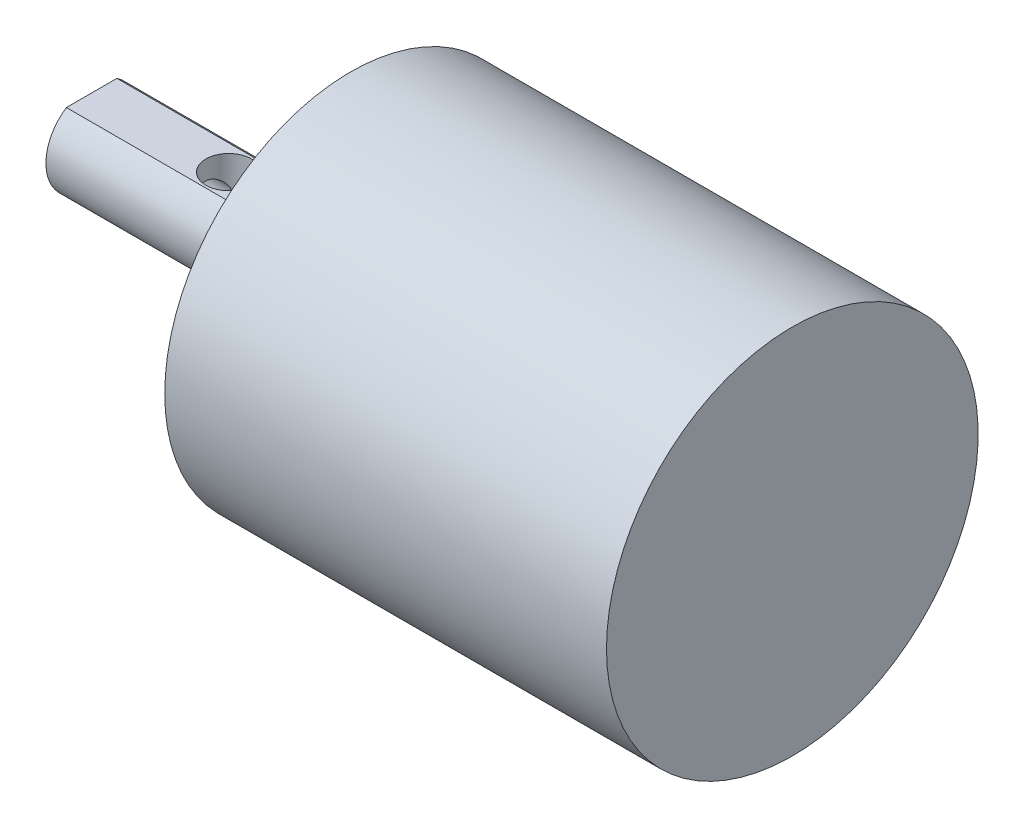
ISO-10303-21;
HEADER;
FILE_DESCRIPTION(('STEP AP214'),'2;1');
FILE_NAME('part.step','',(''),(''),'','','');
FILE_SCHEMA(('AUTOMOTIVE_DESIGN { 1 0 10303 214 1 1 1 1 }'));
ENDSEC;
DATA;
#1=APPLICATION_CONTEXT('core data for automotive mechanical design processes');
#2=APPLICATION_PROTOCOL_DEFINITION('international standard','automotive_design',2000,#1);
#3=PRODUCT_CONTEXT('',#1,'mechanical');
#4=PRODUCT('Part','Part','',(#3));
#5=PRODUCT_RELATED_PRODUCT_CATEGORY('part','',(#4));
#6=PRODUCT_DEFINITION_FORMATION('','',#4);
#7=PRODUCT_DEFINITION_CONTEXT('part definition',#1,'design');
#8=PRODUCT_DEFINITION('design','',#6,#7);
#9=PRODUCT_DEFINITION_SHAPE('','',#8);
#10=(LENGTH_UNIT() NAMED_UNIT(*) SI_UNIT(.MILLI.,.METRE.));
#11=(NAMED_UNIT(*) PLANE_ANGLE_UNIT() SI_UNIT($,.RADIAN.));
#12=(NAMED_UNIT(*) SI_UNIT($,.STERADIAN.) SOLID_ANGLE_UNIT());
#13=UNCERTAINTY_MEASURE_WITH_UNIT(LENGTH_MEASURE(1.E-05),#10,'distance_accuracy_value','');
#14=(GEOMETRIC_REPRESENTATION_CONTEXT(3) GLOBAL_UNCERTAINTY_ASSIGNED_CONTEXT((#13)) GLOBAL_UNIT_ASSIGNED_CONTEXT((#10,
#11,#12)) REPRESENTATION_CONTEXT('',''));
#15=CARTESIAN_POINT('',(0.,0.,0.));
#16=DIRECTION('',(0.,0.,1.));
#17=DIRECTION('',(1.,0.,0.));
#18=AXIS2_PLACEMENT_3D('',#15,#16,#17);
#19=CARTESIAN_POINT('',(-31.6,0.,-5.7));
#20=DIRECTION('',(-1.,0.,0.));
#21=DIRECTION('',(0.,0.,1.));
#22=AXIS2_PLACEMENT_3D('',#19,#20,#21);
#23=PLANE('',#22);
#24=CARTESIAN_POINT('',(-31.6,0.,-12.2));
#25=DIRECTION('',(-1.,0.,0.));
#26=DIRECTION('',(0.,0.,1.));
#27=AXIS2_PLACEMENT_3D('',#24,#25,#26);
#28=CIRCLE('',#27,6.5);
#29=CARTESIAN_POINT('',(-31.6,0.,-5.7));
#30=VERTEX_POINT('',#29);
#31=EDGE_CURVE('E246',#30,#30,#28,.T.);
#32=ORIENTED_EDGE('',*,*,#31,.T.);
#33=EDGE_LOOP('',(#32));
#34=FACE_BOUND('',#33,.T.);
#35=CARTESIAN_POINT('',(-31.6,0.,-12.2));
#36=DIRECTION('',(-1.,0.,0.));
#37=DIRECTION('',(0.,0.,1.));
#38=AXIS2_PLACEMENT_3D('',#35,#36,#37);
#39=CIRCLE('',#38,6.);
#40=CARTESIAN_POINT('',(-31.6,-6.,-12.2));
#41=VERTEX_POINT('',#40);
#42=CARTESIAN_POINT('',(-31.6,-1.5,-18.0094750193111));
#43=VERTEX_POINT('',#42);
#44=EDGE_CURVE('E451',#41,#43,#39,.T.);
#45=ORIENTED_EDGE('',*,*,#44,.F.);
#46=DIRECTION('',(0.,-0.866025403784439,-0.5));
#47=VECTOR('',#46,1.);
#48=CARTESIAN_POINT('',(-31.6,-1.5,-9.60192378864668));
#49=LINE('',#48,#47);
#50=CARTESIAN_POINT('',(-31.6,-1.5,-9.60192378864668));
#51=VERTEX_POINT('',#50);
#52=EDGE_CURVE('E137',#51,#41,#49,.T.);
#53=ORIENTED_EDGE('',*,*,#52,.F.);
#54=CARTESIAN_POINT('',(-31.6,0.,-12.2));
#55=DIRECTION('',(-1.,0.,0.));
#56=DIRECTION('',(0.,0.,1.));
#57=AXIS2_PLACEMENT_3D('',#54,#55,#56);
#58=CIRCLE('',#57,3.);
#59=CARTESIAN_POINT('',(-31.6,1.67021358881229,-14.692064719815));
#60=VERTEX_POINT('',#59);
#61=EDGE_CURVE('E251',#60,#51,#58,.T.);
#62=ORIENTED_EDGE('',*,*,#61,.F.);
#63=DIRECTION('',(0.,0.690885537617151,0.722964158109834));
#64=VECTOR('',#63,1.);
#65=CARTESIAN_POINT('',(-31.6,-1.5,-18.0094750193111));
#66=LINE('',#65,#64);
#67=EDGE_CURVE('E133',#43,#60,#66,.T.);
#68=ORIENTED_EDGE('',*,*,#67,.F.);
#69=EDGE_LOOP('',(#45,#53,#62,#68));
#70=FACE_BOUND('',#69,.T.);
#71=ADVANCED_FACE('F38',(#34,#70),#23,.T.);
#72=CARTESIAN_POINT('',(-38.,0.,-12.2));
#73=DIRECTION('',(-1.,0.,0.));
#74=DIRECTION('',(0.,0.,1.));
#75=AXIS2_PLACEMENT_3D('',#72,#73,#74);
#76=CONICAL_SURFACE('',#75,1.25,1.02974425867665);
#77=CARTESIAN_POINT('',(-38.,0.,-12.2));
#78=DIRECTION('',(-1.,0.,0.));
#79=DIRECTION('',(0.,0.,1.));
#80=AXIS2_PLACEMENT_3D('',#77,#78,#79);
#81=CIRCLE('',#80,1.25);
#82=CARTESIAN_POINT('',(-38.0000000000002,-0.559016994375681,-11.0819660112501));
#83=VERTEX_POINT('',#82);
#84=CARTESIAN_POINT('',(-38.,0.559016994374936,-11.0819660112501));
#85=VERTEX_POINT('',#84);
#86=EDGE_CURVE('E271',#83,#85,#81,.T.);
#87=ORIENTED_EDGE('',*,*,#86,.T.);
#88=CARTESIAN_POINT('',(-38.3344942997963,1.67182864536561,-11.5150730230041));
#89=CARTESIAN_POINT('',(-38.3163163138104,1.62461337100579,-11.4797356637797));
#90=CARTESIAN_POINT('',(-38.2978025805194,1.57566748458989,-11.4470411675325));
#91=CARTESIAN_POINT('',(-38.2606698289528,1.47505980079488,-11.3863641640652));
#92=CARTESIAN_POINT('',(-38.2420509887325,1.42340179901578,-11.3583752904652));
#93=CARTESIAN_POINT('',(-38.2053815652402,1.31844030869776,-11.3066681871802));
#94=CARTESIAN_POINT('',(-38.1873274518685,1.26515499935318,-11.2829149906069));
#95=CARTESIAN_POINT('',(-38.1520698863836,1.15684785990351,-11.2389955295993));
#96=CARTESIAN_POINT('',(-38.1348665247677,1.10182584607487,-11.2188296461695));
#97=CARTESIAN_POINT('',(-38.1033852794018,0.995697674053194,-11.1836131249123));
#98=CARTESIAN_POINT('',(-38.0889854408683,0.944728558681499,-11.1682561957033));
#99=CARTESIAN_POINT('',(-38.0597967193166,0.834790629296757,-11.1382438108772));
#100=CARTESIAN_POINT('',(-38.0452143086519,0.775665123675573,-11.1239581583983));
#101=CARTESIAN_POINT('',(-38.0184820113222,0.656159826572658,-11.0986219232742));
#102=CARTESIAN_POINT('',(-38.0063328702622,0.595779656871998,-11.087572331748));
#103=CARTESIAN_POINT('',(-37.985068558722,0.473955034575553,-11.0686985515051));
#104=CARTESIAN_POINT('',(-37.9759545724139,0.4125101764022,-11.0608756213938));
#105=CARTESIAN_POINT('',(-37.9613193541442,0.288888231348505,-11.0484978839004));
#106=CARTESIAN_POINT('',(-37.9557966272631,0.226711460126279,-11.0439417165944));
#107=CARTESIAN_POINT('',(-37.9481562249803,0.091785197213377,-11.037661195289));
#108=CARTESIAN_POINT('',(-37.9467411664683,0.0189659304869583,-11.0365201930432));
#109=CARTESIAN_POINT('',(-37.9494510655884,-0.126516316671805,-11.0387314295013));
#110=CARTESIAN_POINT('',(-37.9535776368067,-0.199179245411043,-11.0420849769067));
#111=CARTESIAN_POINT('',(-37.9669516642124,-0.343608566475454,-11.0532312688894));
#112=CARTESIAN_POINT('',(-37.9761946558375,-0.415375684730054,-11.0610201433929));
#113=CARTESIAN_POINT('',(-37.9989997200573,-0.557598976481524,-11.0809702950655));
#114=CARTESIAN_POINT('',(-38.0125620504795,-0.628055071455721,-11.0931318332509));
#115=CARTESIAN_POINT('',(-38.0350335922642,-0.730650743837737,-11.1142728399031));
#116=CARTESIAN_POINT('',(-38.0426353188876,-0.763441414072057,-11.1215586180901));
#117=CARTESIAN_POINT('',(-38.0584991446648,-0.828625285516783,-11.1371254386979));
#118=CARTESIAN_POINT('',(-38.0667613479999,-0.861018423088503,-11.1454066382372));
#119=CARTESIAN_POINT('',(-38.1063239543244,-1.01004829929829,-11.1860779268992));
#120=CARTESIAN_POINT('',(-38.1410813614023,-1.12425046766659,-11.2246088087335));
#121=CARTESIAN_POINT('',(-38.1956152274618,-1.28982918043749,-11.2937109068293));
#122=CARTESIAN_POINT('',(-38.214186750954,-1.34405225523453,-11.3186198725106));
#123=CARTESIAN_POINT('',(-38.2516536768637,-1.45020701245779,-11.3726873564154));
#124=CARTESIAN_POINT('',(-38.2705487937918,-1.50214058342003,-11.4018422834869));
#125=CARTESIAN_POINT('',(-38.3008539365346,-1.5835547390461,-11.4528133549099));
#126=CARTESIAN_POINT('',(-38.312335790628,-1.61395901587832,-11.4731137747238));
#127=CARTESIAN_POINT('',(-38.3350582152167,-1.67341145439771,-11.5157501672098));
#128=CARTESIAN_POINT('',(-38.3462987070951,-1.70245917773979,-11.5380867910544));
#129=CARTESIAN_POINT('',(-38.357337512517,-1.73069876832922,-11.561537098091));
#130=B_SPLINE_CURVE_WITH_KNOTS('',3,(#88,#89,#90,#91,#92,#93,#94,#95,#96,#97,#98,#99,#100,#101,
#102,#103,#104,#105,#106,#107,#108,#109,#110,#111,#112,#113,#114,#115,#116,#117,#118,#119,#120,
#121,#122,#123,#124,#125,#126,#127,#128,#129),.UNSPECIFIED.,.F.,.F.,(4,2,2,2,2,2,2,2,2,2,2,2,2,
2,2,2,2,2,2,2,4),(0.,0.184926237952774,0.369600234320969,0.552670945769802,0.735761089354847,
0.901113760928823,1.08862563519459,1.27619487943242,1.46383721870861,1.65140139875104,
1.86956952844741,2.08780119710176,2.3058427374226,2.52389729539921,2.62719498618184,
2.73050900306382,3.10546108420719,3.29282233419519,3.48002602819094,3.59491325714074,
3.70983735647541),.UNSPECIFIED.);
#131=EDGE_CURVE('E67',#85,#83,#130,.T.);
#132=ORIENTED_EDGE('',*,*,#131,.T.);
#133=EDGE_LOOP('',(#87,#132));
#134=FACE_BOUND('',#133,.T.);
#135=ADVANCED_FACE('F214',(#134),#76,.F.);
#136=CARTESIAN_POINT('',(-46.,0.,-12.2));
#137=DIRECTION('',(-1.,0.,0.));
#138=DIRECTION('',(0.,0.,1.));
#139=AXIS2_PLACEMENT_3D('',#136,#137,#138);
#140=CYLINDRICAL_SURFACE('',#139,3.);
#141=DIRECTION('',(1.,0.,0.));
#142=VECTOR('',#141,1.);
#143=CARTESIAN_POINT('',(-32.1,-1.5,-9.60192378864668));
#144=LINE('',#143,#142);
#145=CARTESIAN_POINT('',(-32.1,-1.5,-9.60192378864668));
#146=VERTEX_POINT('',#145);
#147=EDGE_CURVE('E454',#146,#51,#144,.T.);
#148=ORIENTED_EDGE('',*,*,#147,.F.);
#149=CARTESIAN_POINT('',(-32.1,0.,-12.2));
#150=DIRECTION('',(1.,0.,0.));
#151=DIRECTION('',(0.,0.,-1.));
#152=AXIS2_PLACEMENT_3D('',#149,#150,#151);
#153=CIRCLE('',#152,3.);
#154=CARTESIAN_POINT('',(-32.1,1.67021358881229,-14.692064719815));
#155=VERTEX_POINT('',#154);
#156=EDGE_CURVE('E130',#155,#146,#153,.T.);
#157=ORIENTED_EDGE('',*,*,#156,.F.);
#158=DIRECTION('',(1.,0.,0.));
#159=VECTOR('',#158,1.);
#160=CARTESIAN_POINT('',(-32.1,1.67021358881229,-14.692064719815));
#161=LINE('',#160,#159);
#162=EDGE_CURVE('E144',#155,#60,#161,.T.);
#163=ORIENTED_EDGE('',*,*,#162,.T.);
#164=ORIENTED_EDGE('',*,*,#61,.T.);
#165=EDGE_LOOP('',(#148,#157,#163,#164));
#166=FACE_BOUND('',#165,.T.);
#167=CARTESIAN_POINT('',(-37.,-2.59807621135331,-10.7));
#168=CARTESIAN_POINT('',(-37.0781617122929,-2.59808302092688,-10.7000054553882));
#169=CARTESIAN_POINT('',(-37.1564221172876,-2.60165701781634,-10.7061500439002));
#170=CARTESIAN_POINT('',(-37.3105408970157,-2.61543549678078,-10.7304151851529));
#171=CARTESIAN_POINT('',(-37.3863938725651,-2.62565391083339,-10.7485609031687));
#172=CARTESIAN_POINT('',(-37.5331774965159,-2.65124019908097,-10.7958500769503));
#173=CARTESIAN_POINT('',(-37.6041319787104,-2.66658065209878,-10.8249350712594));
#174=CARTESIAN_POINT('',(-37.7401363029951,-2.70063997225286,-10.8930987119354));
#175=CARTESIAN_POINT('',(-37.8051858253937,-2.71935902214096,-10.9321778989463));
#176=CARTESIAN_POINT('',(-37.9334585928363,-2.75995303586162,-11.0230001892037));
#177=CARTESIAN_POINT('',(-37.9960887035103,-2.7819609545693,-11.0755219457843));
#178=CARTESIAN_POINT('',(-38.1121125826101,-2.82557974178558,-11.1901192885783));
#179=CARTESIAN_POINT('',(-38.1655017438753,-2.84719040746875,-11.2521996113266));
#180=CARTESIAN_POINT('',(-38.2650507267215,-2.88932215429424,-11.3892656548782));
#181=CARTESIAN_POINT('',(-38.3104806517893,-2.90967159627259,-11.4648392164811));
#182=CARTESIAN_POINT('',(-38.3877112798686,-2.94526134149294,-11.6237644601007));
#183=CARTESIAN_POINT('',(-38.4195205842058,-2.96050486775612,-11.7071111927928));
#184=CARTESIAN_POINT('',(-38.4662569919517,-2.98320691866356,-11.872932584111));
#185=CARTESIAN_POINT('',(-38.4822242895333,-2.99114220331338,-11.9550473142668));
#186=CARTESIAN_POINT('',(-38.5002491780126,-3.000113757691,-12.1211440569532));
#187=CARTESIAN_POINT('',(-38.5023151851936,-3.00115420176885,-12.2051249087656));
#188=CARTESIAN_POINT('',(-38.4928799890445,-2.99644472874675,-12.3647487866356));
#189=CARTESIAN_POINT('',(-38.4825429767182,-2.99127743838241,-12.4404817987652));
#190=CARTESIAN_POINT('',(-38.450678734143,-2.97561367889621,-12.5889706578775));
#191=CARTESIAN_POINT('',(-38.4291506665357,-2.96511681099591,-12.6617262816409));
#192=CARTESIAN_POINT('',(-38.3753761508653,-2.93957374931481,-12.8034640873543));
#193=CARTESIAN_POINT('',(-38.3429855302419,-2.92446662293799,-12.8723801352728));
#194=CARTESIAN_POINT('',(-38.2686048756978,-2.89106468980031,-13.00396520227));
#195=CARTESIAN_POINT('',(-38.2266114050465,-2.87276874236226,-13.066631973258));
#196=CARTESIAN_POINT('',(-38.1296569727005,-2.83266591598844,-13.1902604913473));
#197=CARTESIAN_POINT('',(-38.073845457511,-2.81069063997262,-13.250501112544));
#198=CARTESIAN_POINT('',(-37.9531154126047,-2.76681510880217,-13.3611565554467));
#199=CARTESIAN_POINT('',(-37.8881899415889,-2.74491492398443,-13.4115638173613));
#200=CARTESIAN_POINT('',(-37.7460277113639,-2.70216234138727,-13.5042580019633));
#201=CARTESIAN_POINT('',(-37.6682709654187,-2.68146479986061,-13.5458259724671));
#202=CARTESIAN_POINT('',(-37.5055934929615,-2.64563175417864,-13.6149786695018));
#203=CARTESIAN_POINT('',(-37.4206803504737,-2.63049045069101,-13.6425779873163));
#204=CARTESIAN_POINT('',(-37.2531782330758,-2.60916953725551,-13.6807703165376));
#205=CARTESIAN_POINT('',(-37.1709383214347,-2.60237483772744,-13.69253768318));
#206=CARTESIAN_POINT('',(-37.0053979877252,-2.59676879042414,-13.7022754199171));
#207=CARTESIAN_POINT('',(-36.9220983563203,-2.59795180333967,-13.7002555359725));
#208=CARTESIAN_POINT('',(-36.7665191221319,-2.60751504810877,-13.6835540650159));
#209=CARTESIAN_POINT('',(-36.6940308233381,-2.61509381259981,-13.6702817250687));
#210=CARTESIAN_POINT('',(-36.5524483205936,-2.63541032327012,-13.6335444269487));
#211=CARTESIAN_POINT('',(-36.4833552238801,-2.64814974007551,-13.6100761679354));
#212=CARTESIAN_POINT('',(-36.3468830036459,-2.67804333119485,-13.5524713829073));
#213=CARTESIAN_POINT('',(-36.2797314747197,-2.69537464864595,-13.5178910955391));
#214=CARTESIAN_POINT('',(-36.1517960926915,-2.73234179245874,-13.4394305960237));
#215=CARTESIAN_POINT('',(-36.0910155347301,-2.75197880032721,-13.3955456064983));
#216=CARTESIAN_POINT('',(-35.9695318487147,-2.79431997684504,-13.2932557507983));
#217=CARTESIAN_POINT('',(-35.9098042739235,-2.81709874731434,-13.2337179084724));
#218=CARTESIAN_POINT('',(-35.8008816430096,-2.86101352466839,-13.1051067430974));
#219=CARTESIAN_POINT('',(-35.7516901446542,-2.88214897511564,-13.036030211983));
#220=CARTESIAN_POINT('',(-35.6641394110748,-2.92112042536435,-12.8878030438381));
#221=CARTESIAN_POINT('',(-35.6261003226836,-2.93885462508044,-12.8084346463612));
#222=CARTESIAN_POINT('',(-35.5642931442139,-2.96825032438951,-12.6432835469616));
#223=CARTESIAN_POINT('',(-35.5405125229505,-2.9799171551456,-12.5575065520883));
#224=CARTESIAN_POINT('',(-35.509947153738,-2.99501262272824,-12.3904695234956));
#225=CARTESIAN_POINT('',(-35.5018031861858,-2.99909891862287,-12.3095171657757));
#226=CARTESIAN_POINT('',(-35.4987351018184,-3.00063195562697,-12.1473110210732));
#227=CARTESIAN_POINT('',(-35.5038063572146,-2.99808102100335,-12.0660573495574));
#228=CARTESIAN_POINT('',(-35.5261246101934,-2.98700953256884,-11.9111930115243));
#229=CARTESIAN_POINT('',(-35.5425472738865,-2.97889342001985,-11.8374315232831));
#230=CARTESIAN_POINT('',(-35.5859904989545,-2.95788140495135,-11.6938310717246));
#231=CARTESIAN_POINT('',(-35.6130125801402,-2.94498481699193,-11.6239926725667));
#232=CARTESIAN_POINT('',(-35.6780905782489,-2.9148889612218,-11.4868648906327));
#233=CARTESIAN_POINT('',(-35.7165689848118,-2.89752925798198,-11.4198122859499));
#234=CARTESIAN_POINT('',(-35.8029368962886,-2.86032199712739,-11.292838037279));
#235=CARTESIAN_POINT('',(-35.8508307236735,-2.84047329837541,-11.2329196888776));
#236=CARTESIAN_POINT('',(-35.9601957085341,-2.79792915339941,-11.1156289937647));
#237=CARTESIAN_POINT('',(-36.0225437312158,-2.77514698517547,-11.0591034731911));
#238=CARTESIAN_POINT('',(-36.1561760816947,-2.73094614244278,-10.957005068908));
#239=CARTESIAN_POINT('',(-36.2274682313015,-2.70952868642798,-10.9114418749849));
#240=CARTESIAN_POINT('',(-36.3799549698714,-2.66999407957374,-10.8313533803215));
#241=CARTESIAN_POINT('',(-36.4613912966931,-2.65200261384405,-10.7972224010586));
#242=CARTESIAN_POINT('',(-36.6299986065097,-2.62299234492527,-10.7436819357404));
#243=CARTESIAN_POINT('',(-36.717149333369,-2.61195024221553,-10.724223213237));
#244=CARTESIAN_POINT('',(-36.837708033478,-2.60293908902686,-10.7084494882034));
#245=CARTESIAN_POINT('',(-36.8700518415968,-2.60112193507727,-10.7052858425542));
#246=CARTESIAN_POINT('',(-36.9349247210234,-2.59868903831625,-10.701059892365));
#247=CARTESIAN_POINT('',(-36.9674538045788,-2.59807337587664,-10.6999977284002));
#248=CARTESIAN_POINT('',(-37.,-2.59807621135331,-10.7));
#249=B_SPLINE_CURVE_WITH_KNOTS('',3,(#167,#168,#169,#170,#171,#172,#173,#174,#175,#176,#177,
#178,#179,#180,#181,#182,#183,#184,#185,#186,#187,#188,#189,#190,#191,#192,#193,#194,#195,#196,
#197,#198,#199,#200,#201,#202,#203,#204,#205,#206,#207,#208,#209,#210,#211,#212,#213,#214,#215,
#216,#217,#218,#219,#220,#221,#222,#223,#224,#225,#226,#227,#228,#229,#230,#231,#232,#233,#234,
#235,#236,#237,#238,#239,#240,#241,#242,#243,#244,#245,#246,#247,#248),.UNSPECIFIED.,.T.,.F.,(4,
2,2,2,2,2,2,2,2,2,2,2,2,2,2,2,2,2,2,2,2,2,2,2,2,2,2,2,2,2,2,2,2,2,2,2,2,2,2,2,4),(0.,
0.234348183892079,0.469189339237211,0.70279289387832,0.936409088167718,1.18929346874735,
1.44230356626557,1.71236838358146,1.98226240445838,2.23295227451904,2.48349035529061,
2.71224146226808,2.94100968776184,3.17294302096721,3.40495949025409,3.65890787185338,
3.91305072368879,4.18333262594173,4.45333161317559,4.70193436281319,4.95036139782561,
5.17161275136041,5.39293578654097,5.62450944609134,5.85620229330073,6.11710115370922,
6.37808797467306,6.64596272119451,6.9136016971316,7.15668405584232,7.3996813019096,
7.62666637307241,7.85368400268022,8.0904112607921,8.32724745151081,8.58765362775104,
8.84828914267734,9.11716123557911,9.38512699504143,9.48270202777967,9.58028358741813),.UNSPECIFIED.);
#250=CARTESIAN_POINT('',(-37.,-2.59807621135331,-10.7));
#251=VERTEX_POINT('',#250);
#252=EDGE_CURVE('E199',#251,#251,#249,.T.);
#253=ORIENTED_EDGE('',*,*,#252,.F.);
#254=EDGE_LOOP('',(#253));
#255=FACE_BOUND('',#254,.T.);
#256=CARTESIAN_POINT('',(-46.,0.,-12.2));
#257=DIRECTION('',(-1.,0.,0.));
#258=DIRECTION('',(0.,0.,1.));
#259=AXIS2_PLACEMENT_3D('',#256,#257,#258);
#260=CIRCLE('',#259,3.);
#261=CARTESIAN_POINT('',(-46.,2.5,-13.8583123951777));
#262=VERTEX_POINT('',#261);
#263=CARTESIAN_POINT('',(-46.,2.5,-10.5416876048223));
#264=VERTEX_POINT('',#263);
#265=EDGE_CURVE('E254',#262,#264,#260,.T.);
#266=ORIENTED_EDGE('',*,*,#265,.F.);
#267=DIRECTION('',(-1.,0.,0.));
#268=VECTOR('',#267,1.);
#269=CARTESIAN_POINT('',(-34.5,2.5,-13.8583123951777));
#270=LINE('',#269,#268);
#271=CARTESIAN_POINT('',(-34.5,2.5,-13.8583123951777));
#272=VERTEX_POINT('',#271);
#273=EDGE_CURVE('E257',#272,#262,#270,.T.);
#274=ORIENTED_EDGE('',*,*,#273,.F.);
#275=CARTESIAN_POINT('',(-34.5,0.,-12.2));
#276=DIRECTION('',(-1.,0.,0.));
#277=DIRECTION('',(0.,0.,1.));
#278=AXIS2_PLACEMENT_3D('',#275,#276,#277);
#279=CIRCLE('',#278,3.00000000000002);
#280=CARTESIAN_POINT('',(-34.5,2.5,-10.5416876048223));
#281=VERTEX_POINT('',#280);
#282=EDGE_CURVE('E261',#281,#272,#279,.T.);
#283=ORIENTED_EDGE('',*,*,#282,.F.);
#284=DIRECTION('',(-1.,0.,0.));
#285=VECTOR('',#284,1.);
#286=CARTESIAN_POINT('',(-34.5,2.5,-10.5416876048223));
#287=LINE('',#286,#285);
#288=EDGE_CURVE('E258',#281,#264,#287,.T.);
#289=ORIENTED_EDGE('',*,*,#288,.T.);
#290=EDGE_LOOP('',(#266,#274,#283,#289));
#291=FACE_BOUND('',#290,.T.);
#292=ADVANCED_FACE('F208',(#166,#255,#291),#140,.T.);
#293=CARTESIAN_POINT('',(-46.,0.,-9.19999999999999));
#294=DIRECTION('',(-1.,0.,0.));
#295=DIRECTION('',(0.,0.,1.));
#296=AXIS2_PLACEMENT_3D('',#293,#294,#295);
#297=PLANE('',#296);
#298=CARTESIAN_POINT('',(-46.,0.,-12.2));
#299=DIRECTION('',(-1.,0.,0.));
#300=DIRECTION('',(0.,0.,1.));
#301=AXIS2_PLACEMENT_3D('',#298,#299,#300);
#302=CIRCLE('',#301,1.25);
#303=CARTESIAN_POINT('',(-46.,0.,-10.95));
#304=VERTEX_POINT('',#303);
#305=EDGE_CURVE('E206',#304,#304,#302,.T.);
#306=ORIENTED_EDGE('',*,*,#305,.F.);
#307=EDGE_LOOP('',(#306));
#308=FACE_BOUND('',#307,.T.);
#309=ORIENTED_EDGE('',*,*,#265,.T.);
#310=DIRECTION('',(0.,0.,-1.));
#311=VECTOR('',#310,1.);
#312=CARTESIAN_POINT('',(-46.,2.5,-12.2));
#313=LINE('',#312,#311);
#314=EDGE_CURVE('E263',#264,#262,#313,.T.);
#315=ORIENTED_EDGE('',*,*,#314,.T.);
#316=EDGE_LOOP('',(#309,#315));
#317=FACE_BOUND('',#316,.T.);
#318=ADVANCED_FACE('F213',(#308,#317),#297,.T.);
#319=CARTESIAN_POINT('',(0.,0.,-12.2));
#320=DIRECTION('',(1.,0.,0.));
#321=DIRECTION('',(0.,0.,-1.));
#322=AXIS2_PLACEMENT_3D('',#319,#320,#321);
#323=PLANE('',#322);
#324=CARTESIAN_POINT('',(0.,0.,-12.2));
#325=DIRECTION('',(-1.,0.,0.));
#326=DIRECTION('',(0.,0.,1.));
#327=AXIS2_PLACEMENT_3D('',#324,#325,#326);
#328=CIRCLE('',#327,12.2);
#329=CARTESIAN_POINT('',(0.,0.,0.));
#330=VERTEX_POINT('',#329);
#331=EDGE_CURVE('E238',#330,#330,#328,.T.);
#332=ORIENTED_EDGE('',*,*,#331,.F.);
#333=EDGE_LOOP('',(#332));
#334=FACE_BOUND('',#333,.T.);
#335=ADVANCED_FACE('F40',(#334),#323,.T.);
#336=CARTESIAN_POINT('',(-46.,0.,-12.2));
#337=DIRECTION('',(-1.,0.,0.));
#338=DIRECTION('',(0.,0.,1.));
#339=AXIS2_PLACEMENT_3D('',#336,#337,#338);
#340=CYLINDRICAL_SURFACE('',#339,12.2);
#341=ORIENTED_EDGE('',*,*,#331,.T.);
#342=EDGE_LOOP('',(#341));
#343=FACE_BOUND('',#342,.T.);
#344=CARTESIAN_POINT('',(-29.,0.,-12.2));
#345=DIRECTION('',(-1.,0.,0.));
#346=DIRECTION('',(0.,0.,1.));
#347=AXIS2_PLACEMENT_3D('',#344,#345,#346);
#348=CIRCLE('',#347,12.2);
#349=CARTESIAN_POINT('',(-29.,0.,0.));
#350=VERTEX_POINT('',#349);
#351=EDGE_CURVE('E241',#350,#350,#348,.T.);
#352=ORIENTED_EDGE('',*,*,#351,.F.);
#353=EDGE_LOOP('',(#352));
#354=FACE_BOUND('',#353,.T.);
#355=ADVANCED_FACE('F227',(#343,#354),#340,.T.);
#356=CARTESIAN_POINT('',(-29.,0.,0.));
#357=DIRECTION('',(-1.,0.,0.));
#358=DIRECTION('',(0.,0.,1.));
#359=AXIS2_PLACEMENT_3D('',#356,#357,#358);
#360=PLANE('',#359);
#361=CARTESIAN_POINT('',(-29.,9.5,-12.2));
#362=DIRECTION('',(-1.,0.,0.));
#363=DIRECTION('',(0.,0.,1.));
#364=AXIS2_PLACEMENT_3D('',#361,#362,#363);
#365=CIRCLE('',#364,1.25);
#366=CARTESIAN_POINT('',(-29.,9.5,-10.95));
#367=VERTEX_POINT('',#366);
#368=EDGE_CURVE('E139',#367,#367,#365,.T.);
#369=ORIENTED_EDGE('',*,*,#368,.F.);
#370=EDGE_LOOP('',(#369));
#371=FACE_BOUND('',#370,.T.);
#372=CARTESIAN_POINT('',(-29.,-4.75000000000016,-20.4272413359518));
#373=DIRECTION('',(-1.,0.,0.));
#374=DIRECTION('',(0.,0.,1.));
#375=AXIS2_PLACEMENT_3D('',#372,#373,#374);
#376=CIRCLE('',#375,1.25);
#377=CARTESIAN_POINT('',(-29.,-4.75000000000016,-19.1772413359518));
#378=VERTEX_POINT('',#377);
#379=EDGE_CURVE('E150',#378,#378,#376,.T.);
#380=ORIENTED_EDGE('',*,*,#379,.F.);
#381=EDGE_LOOP('',(#380));
#382=FACE_BOUND('',#381,.T.);
#383=CARTESIAN_POINT('',(-29.,-4.74999999999981,-3.97275866404745));
#384=DIRECTION('',(-1.,0.,0.));
#385=DIRECTION('',(0.,0.,1.));
#386=AXIS2_PLACEMENT_3D('',#383,#384,#385);
#387=CIRCLE('',#386,1.25);
#388=CARTESIAN_POINT('',(-29.,-4.74999999999981,-2.72275866404745));
#389=VERTEX_POINT('',#388);
#390=EDGE_CURVE('E156',#389,#389,#387,.T.);
#391=ORIENTED_EDGE('',*,*,#390,.F.);
#392=EDGE_LOOP('',(#391));
#393=FACE_BOUND('',#392,.T.);
#394=ORIENTED_EDGE('',*,*,#351,.T.);
#395=EDGE_LOOP('',(#394));
#396=FACE_BOUND('',#395,.T.);
#397=CARTESIAN_POINT('',(-29.,0.,-12.2));
#398=DIRECTION('',(-1.,0.,0.));
#399=DIRECTION('',(0.,0.,1.));
#400=AXIS2_PLACEMENT_3D('',#397,#398,#399);
#401=CIRCLE('',#400,6.5);
#402=CARTESIAN_POINT('',(-29.,0.,-5.7));
#403=VERTEX_POINT('',#402);
#404=EDGE_CURVE('E243',#403,#403,#401,.T.);
#405=ORIENTED_EDGE('',*,*,#404,.F.);
#406=EDGE_LOOP('',(#405));
#407=FACE_BOUND('',#406,.T.);
#408=ADVANCED_FACE('F224',(#371,#382,#393,#396,#407),#360,.T.);
#409=CARTESIAN_POINT('',(-46.,0.,-12.2));
#410=DIRECTION('',(-1.,0.,0.));
#411=DIRECTION('',(0.,0.,1.));
#412=AXIS2_PLACEMENT_3D('',#409,#410,#411);
#413=CYLINDRICAL_SURFACE('',#412,6.5);
#414=ORIENTED_EDGE('',*,*,#404,.T.);
#415=EDGE_LOOP('',(#414));
#416=FACE_BOUND('',#415,.T.);
#417=ORIENTED_EDGE('',*,*,#31,.F.);
#418=EDGE_LOOP('',(#417));
#419=FACE_BOUND('',#418,.T.);
#420=ADVANCED_FACE('F220',(#416,#419),#413,.T.);
#421=CARTESIAN_POINT('',(-34.5,2.5,-12.2));
#422=DIRECTION('',(0.,1.,0.));
#423=DIRECTION('',(0.,0.,1.));
#424=AXIS2_PLACEMENT_3D('',#421,#422,#423);
#425=PLANE('',#424);
#426=CARTESIAN_POINT('',(-37.,2.5,-12.2));
#427=DIRECTION('',(0.,1.,0.));
#428=DIRECTION('',(0.,0.,1.));
#429=AXIS2_PLACEMENT_3D('',#426,#427,#428);
#430=CIRCLE('',#429,1.5);
#431=CARTESIAN_POINT('',(-37.,2.5,-10.7));
#432=VERTEX_POINT('',#431);
#433=EDGE_CURVE('E162',#432,#432,#430,.T.);
#434=ORIENTED_EDGE('',*,*,#433,.F.);
#435=EDGE_LOOP('',(#434));
#436=FACE_BOUND('',#435,.T.);
#437=ORIENTED_EDGE('',*,*,#314,.F.);
#438=ORIENTED_EDGE('',*,*,#288,.F.);
#439=DIRECTION('',(0.,0.,1.));
#440=VECTOR('',#439,1.);
#441=CARTESIAN_POINT('',(-34.5,2.5,-12.2));
#442=LINE('',#441,#440);
#443=EDGE_CURVE('E266',#272,#281,#442,.T.);
#444=ORIENTED_EDGE('',*,*,#443,.F.);
#445=ORIENTED_EDGE('',*,*,#273,.T.);
#446=EDGE_LOOP('',(#437,#438,#444,#445));
#447=FACE_BOUND('',#446,.T.);
#448=ADVANCED_FACE('F223',(#436,#447),#425,.T.);
#449=CARTESIAN_POINT('',(-34.5,0.,-12.2));
#450=DIRECTION('',(-1.,0.,0.));
#451=DIRECTION('',(0.,0.,1.));
#452=AXIS2_PLACEMENT_3D('',#449,#450,#451);
#453=PLANE('',#452);
#454=ORIENTED_EDGE('',*,*,#443,.T.);
#455=ORIENTED_EDGE('',*,*,#282,.T.);
#456=EDGE_LOOP('',(#454,#455));
#457=FACE_BOUND('',#456,.T.);
#458=ADVANCED_FACE('F288',(#457),#453,.T.);
#459=CARTESIAN_POINT('',(-38.,0.559016994374937,-13.3180339887499));
#460=VERTEX_POINT('',#459);
#461=CARTESIAN_POINT('',(-38.,-0.559016994374936,-13.3180339887499));
#462=VERTEX_POINT('',#461);
#463=EDGE_CURVE('E267',#460,#462,#81,.T.);
#464=ORIENTED_EDGE('',*,*,#463,.T.);
#465=CARTESIAN_POINT('',(-38.357337512518,-1.73069876833152,-12.8384629019133));
#466=CARTESIAN_POINT('',(-38.3416763680001,-1.69063064309795,-12.8716915870004));
#467=CARTESIAN_POINT('',(-38.3256263968215,-1.64898638281895,-12.90270939189));
#468=CARTESIAN_POINT('',(-38.2931943321079,-1.56323246878673,-12.960772046675));
#469=CARTESIAN_POINT('',(-38.2768128291763,-1.51912698891127,-12.9878233564981));
#470=CARTESIAN_POINT('',(-38.2442273933087,-1.42932804616627,-13.038324344716));
#471=CARTESIAN_POINT('',(-38.2280230338936,-1.38364840891032,-13.0617987050465));
#472=CARTESIAN_POINT('',(-38.1959923895335,-1.29071808090079,-13.1057275968026));
#473=CARTESIAN_POINT('',(-38.180166219204,-1.24346692399837,-13.1261812222423));
#474=CARTESIAN_POINT('',(-38.1488403957075,-1.14648877634816,-13.1647784543496));
#475=CARTESIAN_POINT('',(-38.1333577547654,-1.09672957094134,-13.1828546577088));
#476=CARTESIAN_POINT('',(-38.1034429657484,-0.995902077361143,-13.2163258088024));
#477=CARTESIAN_POINT('',(-38.0890127795902,-0.944831572768664,-13.2317158199153));
#478=CARTESIAN_POINT('',(-38.0597901609565,-0.834765877622229,-13.2617627901166));
#479=CARTESIAN_POINT('',(-38.0452021309592,-0.775615751968252,-13.276053735535));
#480=CARTESIAN_POINT('',(-38.0184608549412,-0.656060175526236,-13.3013977753959));
#481=CARTESIAN_POINT('',(-38.0063083418665,-0.595654352866291,-13.3124498956057));
#482=CARTESIAN_POINT('',(-37.9850490750211,-0.473828179755903,-13.3313182825982));
#483=CARTESIAN_POINT('',(-37.9759409967393,-0.412408282725226,-13.3391359569111));
#484=CARTESIAN_POINT('',(-37.9613147888408,-0.288836884752255,-13.3515058802131));
#485=CARTESIAN_POINT('',(-37.9557951711167,-0.226685697970261,-13.3560594828684));
#486=CARTESIAN_POINT('',(-37.9481574307883,-0.0918065462113296,-13.3623378106235));
#487=CARTESIAN_POINT('',(-37.9467419811499,-0.0190088054201476,-13.3634791348567));
#488=CARTESIAN_POINT('',(-37.9494478486807,0.12643025052508,-13.3612712019889));
#489=CARTESIAN_POINT('',(-37.953570737455,0.199071515416633,-13.3579206702421));
#490=CARTESIAN_POINT('',(-37.9669387067779,0.34350184489272,-13.3467796303437));
#491=CARTESIAN_POINT('',(-37.9761824300185,0.415291130151566,-13.3389902987071));
#492=CARTESIAN_POINT('',(-37.9989918813232,0.557558407005653,-13.319036814153));
#493=CARTESIAN_POINT('',(-38.0125578044437,0.628036339268966,-13.3068724637923));
#494=CARTESIAN_POINT('',(-38.0350375926652,0.730668698362949,-13.2857232532584));
#495=CARTESIAN_POINT('',(-38.0426436746983,0.76347652217629,-13.2784329649836));
#496=CARTESIAN_POINT('',(-38.0585087507992,0.828663982104102,-13.2628653542843));
#497=CARTESIAN_POINT('',(-38.0667671020886,0.861044003945561,-13.2545889995869));
#498=CARTESIAN_POINT('',(-38.0852584349279,0.930691248019206,-13.2355761122347));
#499=CARTESIAN_POINT('',(-38.0955922908871,0.967882494282018,-13.2246590123398));
#500=CARTESIAN_POINT('',(-38.1168864003965,1.04165264437685,-13.2014056560954));
#501=CARTESIAN_POINT('',(-38.1278468996048,1.07823130069329,-13.1890688412394));
#502=CARTESIAN_POINT('',(-38.1543936290504,1.16409250643103,-13.1580878401579));
#503=CARTESIAN_POINT('',(-38.1701934128306,1.21307829176472,-13.1387967934602));
#504=CARTESIAN_POINT('',(-38.2023670893229,1.30956375241499,-13.0972197297798));
#505=CARTESIAN_POINT('',(-38.2187409290717,1.35706356406877,-13.0749339885578));
#506=CARTESIAN_POINT('',(-38.2517895940856,1.45046724337832,-13.0269705296034));
#507=CARTESIAN_POINT('',(-38.2684652793174,1.49636486960582,-13.0012810893455));
#508=CARTESIAN_POINT('',(-38.3016838221897,1.585921789149,-12.9460823306311));
#509=CARTESIAN_POINT('',(-38.3182265055986,1.6295784555404,-12.9165686658986));
#510=CARTESIAN_POINT('',(-38.3344942997963,1.67182864536561,-12.8849269769958));
#511=B_SPLINE_CURVE_WITH_KNOTS('',3,(#465,#466,#467,#468,#469,#470,#471,#472,#473,#474,#475,
#476,#477,#478,#479,#480,#481,#482,#483,#484,#485,#486,#487,#488,#489,#490,#491,#492,#493,#494,
#495,#496,#497,#498,#499,#500,#501,#502,#503,#504,#505,#506,#507,#508,#509,#510),.UNSPECIFIED.,
.F.,.F.,(4,2,2,2,2,2,2,2,2,2,2,2,2,2,2,2,2,2,2,2,2,2,4),(0.,0.162895121918518,0.325521929902963,
0.486970099286134,0.648466592671878,0.813847906716484,0.979530025747582,1.16711999304251,
1.35476632927307,1.54233092155205,1.72981768252213,1.94792167188443,2.16608756532415,
2.38419566022831,2.6023135995141,2.70566975871945,2.80892530685714,2.92923257499457,
3.04958733404962,3.21438594021988,3.3791693816058,3.54453586110778,3.71009195761573),.UNSPECIFIED.);
#512=EDGE_CURVE('E165',#462,#460,#511,.T.);
#513=ORIENTED_EDGE('',*,*,#512,.T.);
#514=EDGE_LOOP('',(#464,#513));
#515=FACE_BOUND('',#514,.T.);
#516=ADVANCED_FACE('F178',(#515),#76,.F.);
#517=CARTESIAN_POINT('',(-46.,0.,-12.2));
#518=DIRECTION('',(-1.,0.,0.));
#519=DIRECTION('',(0.,0.,1.));
#520=AXIS2_PLACEMENT_3D('',#517,#518,#519);
#521=CYLINDRICAL_SURFACE('',#520,1.25);
#522=ORIENTED_EDGE('',*,*,#86,.F.);
#523=CARTESIAN_POINT('',(-38.,-0.559016994374937,-11.0819660112501));
#524=CARTESIAN_POINT('',(-38.0194867401772,-0.5938116353446,-11.0993819355741));
#525=CARTESIAN_POINT('',(-38.0395500242899,-0.627533050357172,-11.1182559236176));
#526=CARTESIAN_POINT('',(-38.0802292976327,-0.6928700668103,-11.1588838316317));
#527=CARTESIAN_POINT('',(-38.1008455350158,-0.724484699822701,-11.1806390624879));
#528=CARTESIAN_POINT('',(-38.1421753273605,-0.785860465048294,-11.2271617714466));
#529=CARTESIAN_POINT('',(-38.162888349999,-0.815604833168993,-11.2519518565902));
#530=CARTESIAN_POINT('',(-38.2037380548522,-0.872862085988991,-11.3043888842079));
#531=CARTESIAN_POINT('',(-38.2238748905018,-0.900375568406187,-11.3320350569102));
#532=CARTESIAN_POINT('',(-38.2756674154182,-0.969875806533162,-11.4088117052389));
#533=CARTESIAN_POINT('',(-38.3064602014297,-1.00987496618826,-11.4603810096638));
#534=CARTESIAN_POINT('',(-38.3631063638437,-1.08215411508672,-11.57089168387));
#535=CARTESIAN_POINT('',(-38.3889762773052,-1.11446004304221,-11.6298072307547));
#536=CARTESIAN_POINT('',(-38.4296504662953,-1.16472101850466,-11.742821604102));
#537=CARTESIAN_POINT('',(-38.4456152770018,-1.18422337211217,-11.7958086704342));
#538=CARTESIAN_POINT('',(-38.4718334910525,-1.21609063067817,-11.9052688078008));
#539=CARTESIAN_POINT('',(-38.4820884938496,-1.22845753448095,-11.9617408976686));
#540=CARTESIAN_POINT('',(-38.4960722752503,-1.24529297222234,-12.0769303374175));
#541=CARTESIAN_POINT('',(-38.499771424593,-1.24972564821476,-12.135656661469));
#542=CARTESIAN_POINT('',(-38.500207770124,-1.25024938539999,-12.2531705278088));
#543=CARTESIAN_POINT('',(-38.4969458256661,-1.24634147624605,-12.311958061645));
#544=CARTESIAN_POINT('',(-38.4842685606535,-1.23108449653816,-12.4232716716931));
#545=CARTESIAN_POINT('',(-38.4753350644915,-1.22031787904697,-12.4759359129924));
#546=CARTESIAN_POINT('',(-38.4524338706043,-1.19252918146529,-12.5784103736849));
#547=CARTESIAN_POINT('',(-38.4384660511753,-1.1755069501463,-12.6282205240471));
#548=CARTESIAN_POINT('',(-38.4051383905753,-1.13449025374566,-12.7277755818694));
#549=CARTESIAN_POINT('',(-38.3854511130566,-1.11006647127365,-12.7772317284504));
#550=CARTESIAN_POINT('',(-38.3423711562459,-1.0558084859981,-12.8713617539319));
#551=CARTESIAN_POINT('',(-38.3189734201437,-1.02596689135403,-12.916028964918));
#552=CARTESIAN_POINT('',(-38.2577871516318,-0.9462903537527,-13.0204762276954));
#553=CARTESIAN_POINT('',(-38.2184662406941,-0.893717359927136,-13.077273043476));
#554=CARTESIAN_POINT('',(-38.1377354201025,-0.780106476414977,-13.1796905401557));
#555=CARTESIAN_POINT('',(-38.0963267223181,-0.719073462217301,-13.2253176165531));
#556=CARTESIAN_POINT('',(-38.0465127213638,-0.638615223507807,-13.2747062239765));
#557=CARTESIAN_POINT('',(-38.0370529250604,-0.623009324567268,-13.2838298821681));
#558=CARTESIAN_POINT('',(-38.0183504367789,-0.591355929063154,-13.3014199965019));
#559=CARTESIAN_POINT('',(-38.0091073547793,-0.575309360322806,-13.3098877086027));
#560=CARTESIAN_POINT('',(-38.0000000000005,-0.559016994375569,-13.3180339887514));
#561=B_SPLINE_CURVE_WITH_KNOTS('',3,(#523,#524,#525,#526,#527,#528,#529,#530,#531,#532,#533,
#534,#535,#536,#537,#538,#539,#540,#541,#542,#543,#544,#545,#546,#547,#548,#549,#550,#551,#552,
#553,#554,#555,#556,#557,#558,#559,#560),.UNSPECIFIED.,.F.,.F.,(4,2,2,2,2,2,2,2,2,2,2,2,2,2,2,2,
2,2,4),(0.,0.130485614831922,0.261030802269519,0.392615521128763,0.524164867385224,
0.739784958918602,0.954667427152361,1.12996833178603,1.30522010573319,1.48126193160863,
1.65728202620879,1.8200483466679,1.98281860223685,2.1578759679148,2.33317399451223,
2.59227356874168,2.85122444056858,2.9124223567735,2.97350004024469),.UNSPECIFIED.);
#562=EDGE_CURVE('E11',#83,#462,#561,.T.);
#563=ORIENTED_EDGE('',*,*,#562,.T.);
#564=ORIENTED_EDGE('',*,*,#463,.F.);
#565=CARTESIAN_POINT('',(-38.,0.559016994374937,-13.3180339887499));
#566=CARTESIAN_POINT('',(-38.0194867401772,0.5938116353446,-13.3006180644259));
#567=CARTESIAN_POINT('',(-38.0395500242899,0.627533050357172,-13.2817440763824));
#568=CARTESIAN_POINT('',(-38.0802292976327,0.6928700668103,-13.2411161683683));
#569=CARTESIAN_POINT('',(-38.1008455350158,0.724484699822701,-13.2193609375121));
#570=CARTESIAN_POINT('',(-38.1421753273605,0.785860465048294,-13.1728382285534));
#571=CARTESIAN_POINT('',(-38.162888349999,0.815604833168993,-13.1480481434098));
#572=CARTESIAN_POINT('',(-38.2037380548522,0.872862085988991,-13.0956111157921));
#573=CARTESIAN_POINT('',(-38.2238748905018,0.900375568406187,-13.0679649430898));
#574=CARTESIAN_POINT('',(-38.2756674154182,0.969875806533162,-12.9911882947611));
#575=CARTESIAN_POINT('',(-38.3064602014297,1.00987496618826,-12.9396189903362));
#576=CARTESIAN_POINT('',(-38.3631063638437,1.08215411508672,-12.82910831613));
#577=CARTESIAN_POINT('',(-38.3889762773052,1.11446004304221,-12.7701927692453));
#578=CARTESIAN_POINT('',(-38.4296504662953,1.16472101850465,-12.6571783958979));
#579=CARTESIAN_POINT('',(-38.4456152770018,1.18422337211217,-12.6041913295658));
#580=CARTESIAN_POINT('',(-38.4718334910525,1.21609063067817,-12.4947311921992));
#581=CARTESIAN_POINT('',(-38.4820884938496,1.22845753448095,-12.4382591023314));
#582=CARTESIAN_POINT('',(-38.4960722752503,1.24529297222234,-12.3230696625825));
#583=CARTESIAN_POINT('',(-38.499771424593,1.24972564821476,-12.264343338531));
#584=CARTESIAN_POINT('',(-38.500207770124,1.25024938539999,-12.1468294721912));
#585=CARTESIAN_POINT('',(-38.4969458256661,1.24634147624605,-12.088041938355));
#586=CARTESIAN_POINT('',(-38.4842685606535,1.23108449653816,-11.9767283283069));
#587=CARTESIAN_POINT('',(-38.4753350644915,1.22031787904697,-11.9240640870076));
#588=CARTESIAN_POINT('',(-38.4524338706043,1.19252918146529,-11.8215896263151));
#589=CARTESIAN_POINT('',(-38.4384660511753,1.1755069501463,-11.7717794759529));
#590=CARTESIAN_POINT('',(-38.4051383905753,1.13449025374566,-11.6722244181306));
#591=CARTESIAN_POINT('',(-38.3854511130566,1.11006647127365,-11.6227682715495));
#592=CARTESIAN_POINT('',(-38.3423711562459,1.0558084859981,-11.5286382460681));
#593=CARTESIAN_POINT('',(-38.3189734201437,1.02596689135403,-11.483971035082));
#594=CARTESIAN_POINT('',(-38.2577871516318,0.9462903537527,-11.3795237723046));
#595=CARTESIAN_POINT('',(-38.2184662406941,0.893717359927136,-11.322726956524));
#596=CARTESIAN_POINT('',(-38.1377354201025,0.780106476414977,-11.2203094598443));
#597=CARTESIAN_POINT('',(-38.0963267223181,0.719073462217302,-11.1746823834469));
#598=CARTESIAN_POINT('',(-38.0465127213638,0.638615223507807,-11.1252937760235));
#599=CARTESIAN_POINT('',(-38.0370529250604,0.623009324567268,-11.1161701178319));
#600=CARTESIAN_POINT('',(-38.0183504367789,0.591355929063154,-11.0985800034981));
#601=CARTESIAN_POINT('',(-38.0091073547793,0.575309360322805,-11.0901122913973));
#602=CARTESIAN_POINT('',(-38.0000000000005,0.559016994375569,-11.0819660112486));
#603=B_SPLINE_CURVE_WITH_KNOTS('',3,(#565,#566,#567,#568,#569,#570,#571,#572,#573,#574,#575,
#576,#577,#578,#579,#580,#581,#582,#583,#584,#585,#586,#587,#588,#589,#590,#591,#592,#593,#594,
#595,#596,#597,#598,#599,#600,#601,#602),.UNSPECIFIED.,.F.,.F.,(4,2,2,2,2,2,2,2,2,2,2,2,2,2,2,2,
2,2,4),(0.,0.130485614831922,0.261030802269519,0.392615521128763,0.524164867385224,
0.739784958918602,0.954667427152361,1.12996833178603,1.30522010573319,1.48126193160863,
1.65728202620879,1.8200483466679,1.98281860223685,2.1578759679148,2.33317399451223,
2.59227356874168,2.85122444056858,2.9124223567735,2.97350004024469),.UNSPECIFIED.);
#604=EDGE_CURVE('E52',#460,#85,#603,.T.);
#605=ORIENTED_EDGE('',*,*,#604,.T.);
#606=EDGE_LOOP('',(#522,#563,#564,#605));
#607=FACE_BOUND('',#606,.T.);
#608=ORIENTED_EDGE('',*,*,#305,.T.);
#609=EDGE_LOOP('',(#608));
#610=FACE_BOUND('',#609,.T.);
#611=ADVANCED_FACE('F186',(#607,#610),#521,.F.);
#612=CARTESIAN_POINT('',(-37.,-9.,-12.2));
#613=DIRECTION('',(0.,1.,0.));
#614=DIRECTION('',(0.,0.,1.));
#615=AXIS2_PLACEMENT_3D('',#612,#613,#614);
#616=CYLINDRICAL_SURFACE('',#615,1.5);
#617=ORIENTED_EDGE('',*,*,#252,.T.);
#618=EDGE_LOOP('',(#617));
#619=FACE_BOUND('',#618,.T.);
#620=ORIENTED_EDGE('',*,*,#433,.T.);
#621=EDGE_LOOP('',(#620));
#622=FACE_BOUND('',#621,.T.);
#623=ORIENTED_EDGE('',*,*,#131,.F.);
#624=ORIENTED_EDGE('',*,*,#604,.F.);
#625=ORIENTED_EDGE('',*,*,#512,.F.);
#626=ORIENTED_EDGE('',*,*,#562,.F.);
#627=EDGE_LOOP('',(#623,#624,#625,#626));
#628=FACE_BOUND('',#627,.T.);
#629=ADVANCED_FACE('F181',(#619,#622,#628),#616,.F.);
#630=CARTESIAN_POINT('',(-25.,-4.74999999999981,-3.97275866404745));
#631=DIRECTION('',(-1.,0.,0.));
#632=DIRECTION('',(0.,0.,1.));
#633=AXIS2_PLACEMENT_3D('',#630,#631,#632);
#634=CONICAL_SURFACE('',#633,1.25,1.02974425867665);
#635=CARTESIAN_POINT('',(-24.2489242262155,-4.74999999999981,-3.97275866404745));
#636=VERTEX_POINT('',#635);
#637=VERTEX_LOOP('',#636);
#638=FACE_BOUND('',#637,.T.);
#639=CARTESIAN_POINT('',(-25.,-4.74999999999981,-3.97275866404745));
#640=DIRECTION('',(-1.,0.,0.));
#641=DIRECTION('',(0.,0.,1.));
#642=AXIS2_PLACEMENT_3D('',#639,#640,#641);
#643=CIRCLE('',#642,1.25);
#644=CARTESIAN_POINT('',(-25.,-4.74999999999981,-2.72275866404745));
#645=VERTEX_POINT('',#644);
#646=EDGE_CURVE('E159',#645,#645,#643,.T.);
#647=ORIENTED_EDGE('',*,*,#646,.T.);
#648=EDGE_LOOP('',(#647));
#649=FACE_BOUND('',#648,.T.);
#650=ADVANCED_FACE('F185',(#638,#649),#634,.F.);
#651=CARTESIAN_POINT('',(-29.,-4.74999999999981,-3.97275866404745));
#652=DIRECTION('',(-1.,0.,0.));
#653=DIRECTION('',(0.,0.,1.));
#654=AXIS2_PLACEMENT_3D('',#651,#652,#653);
#655=CYLINDRICAL_SURFACE('',#654,1.25);
#656=ORIENTED_EDGE('',*,*,#646,.F.);
#657=EDGE_LOOP('',(#656));
#658=FACE_BOUND('',#657,.T.);
#659=ORIENTED_EDGE('',*,*,#390,.T.);
#660=EDGE_LOOP('',(#659));
#661=FACE_BOUND('',#660,.T.);
#662=ADVANCED_FACE('F339',(#658,#661),#655,.F.);
#663=CARTESIAN_POINT('',(-25.,-4.75000000000016,-20.4272413359518));
#664=DIRECTION('',(-1.,0.,0.));
#665=DIRECTION('',(0.,0.,1.));
#666=AXIS2_PLACEMENT_3D('',#663,#664,#665);
#667=CONICAL_SURFACE('',#666,1.25,1.02974425867665);
#668=CARTESIAN_POINT('',(-24.2489242262155,-4.75000000000016,-20.4272413359518));
#669=VERTEX_POINT('',#668);
#670=VERTEX_LOOP('',#669);
#671=FACE_BOUND('',#670,.T.);
#672=CARTESIAN_POINT('',(-25.,-4.75000000000016,-20.4272413359518));
#673=DIRECTION('',(-1.,0.,0.));
#674=DIRECTION('',(0.,0.,1.));
#675=AXIS2_PLACEMENT_3D('',#672,#673,#674);
#676=CIRCLE('',#675,1.25);
#677=CARTESIAN_POINT('',(-25.,-4.75000000000016,-19.1772413359518));
#678=VERTEX_POINT('',#677);
#679=EDGE_CURVE('E153',#678,#678,#676,.T.);
#680=ORIENTED_EDGE('',*,*,#679,.T.);
#681=EDGE_LOOP('',(#680));
#682=FACE_BOUND('',#681,.T.);
#683=ADVANCED_FACE('F334',(#671,#682),#667,.F.);
#684=CARTESIAN_POINT('',(-29.,-4.75000000000016,-20.4272413359518));
#685=DIRECTION('',(-1.,0.,0.));
#686=DIRECTION('',(0.,0.,1.));
#687=AXIS2_PLACEMENT_3D('',#684,#685,#686);
#688=CYLINDRICAL_SURFACE('',#687,1.25);
#689=ORIENTED_EDGE('',*,*,#679,.F.);
#690=EDGE_LOOP('',(#689));
#691=FACE_BOUND('',#690,.T.);
#692=ORIENTED_EDGE('',*,*,#379,.T.);
#693=EDGE_LOOP('',(#692));
#694=FACE_BOUND('',#693,.T.);
#695=ADVANCED_FACE('F324',(#691,#694),#688,.F.);
#696=CARTESIAN_POINT('',(-25.,9.5,-12.2));
#697=DIRECTION('',(-1.,0.,0.));
#698=DIRECTION('',(0.,0.,1.));
#699=AXIS2_PLACEMENT_3D('',#696,#697,#698);
#700=CONICAL_SURFACE('',#699,1.25,1.02974425867665);
#701=CARTESIAN_POINT('',(-24.2489242262155,9.5,-12.2));
#702=VERTEX_POINT('',#701);
#703=VERTEX_LOOP('',#702);
#704=FACE_BOUND('',#703,.T.);
#705=CARTESIAN_POINT('',(-25.,9.5,-12.2));
#706=DIRECTION('',(-1.,0.,0.));
#707=DIRECTION('',(0.,0.,1.));
#708=AXIS2_PLACEMENT_3D('',#705,#706,#707);
#709=CIRCLE('',#708,1.25);
#710=CARTESIAN_POINT('',(-25.,9.5,-10.95));
#711=VERTEX_POINT('',#710);
#712=EDGE_CURVE('E142',#711,#711,#709,.T.);
#713=ORIENTED_EDGE('',*,*,#712,.T.);
#714=EDGE_LOOP('',(#713));
#715=FACE_BOUND('',#714,.T.);
#716=ADVANCED_FACE('F318',(#704,#715),#700,.F.);
#717=CARTESIAN_POINT('',(-29.,9.5,-12.2));
#718=DIRECTION('',(-1.,0.,0.));
#719=DIRECTION('',(0.,0.,1.));
#720=AXIS2_PLACEMENT_3D('',#717,#718,#719);
#721=CYLINDRICAL_SURFACE('',#720,1.25);
#722=ORIENTED_EDGE('',*,*,#712,.F.);
#723=EDGE_LOOP('',(#722));
#724=FACE_BOUND('',#723,.T.);
#725=ORIENTED_EDGE('',*,*,#368,.T.);
#726=EDGE_LOOP('',(#725));
#727=FACE_BOUND('',#726,.T.);
#728=ADVANCED_FACE('F323',(#724,#727),#721,.F.);
#729=CARTESIAN_POINT('',(-32.1,-1.5,-9.60192378864668));
#730=DIRECTION('',(0.,-0.5,0.866025403784439));
#731=DIRECTION('',(0.,-0.866025403784439,-0.5));
#732=AXIS2_PLACEMENT_3D('',#729,#730,#731);
#733=PLANE('',#732);
#734=ORIENTED_EDGE('',*,*,#52,.T.);
#735=DIRECTION('',(1.,0.,0.));
#736=VECTOR('',#735,1.);
#737=CARTESIAN_POINT('',(-32.1,-6.,-12.2));
#738=LINE('',#737,#736);
#739=CARTESIAN_POINT('',(-32.1,-6.,-12.2));
#740=VERTEX_POINT('',#739);
#741=EDGE_CURVE('E121',#740,#41,#738,.T.);
#742=ORIENTED_EDGE('',*,*,#741,.F.);
#743=DIRECTION('',(0.,-0.866025403784439,-0.5));
#744=VECTOR('',#743,1.);
#745=CARTESIAN_POINT('',(-32.1,-1.5,-9.60192378864668));
#746=LINE('',#745,#744);
#747=EDGE_CURVE('E125',#146,#740,#746,.T.);
#748=ORIENTED_EDGE('',*,*,#747,.F.);
#749=ORIENTED_EDGE('',*,*,#147,.T.);
#750=EDGE_LOOP('',(#734,#742,#748,#749));
#751=FACE_BOUND('',#750,.T.);
#752=ADVANCED_FACE('F135',(#751),#733,.F.);
#753=CARTESIAN_POINT('',(-32.1,0.,-12.2));
#754=DIRECTION('',(1.,0.,0.));
#755=DIRECTION('',(0.,0.,-1.));
#756=AXIS2_PLACEMENT_3D('',#753,#754,#755);
#757=CYLINDRICAL_SURFACE('',#756,6.);
#758=ORIENTED_EDGE('',*,*,#44,.T.);
#759=DIRECTION('',(1.,0.,0.));
#760=VECTOR('',#759,1.);
#761=CARTESIAN_POINT('',(-32.1,-1.5,-18.0094750193111));
#762=LINE('',#761,#760);
#763=CARTESIAN_POINT('',(-32.1,-1.5,-18.0094750193111));
#764=VERTEX_POINT('',#763);
#765=EDGE_CURVE('E59',#764,#43,#762,.T.);
#766=ORIENTED_EDGE('',*,*,#765,.F.);
#767=CARTESIAN_POINT('',(-32.1,0.,-12.2));
#768=DIRECTION('',(-1.,0.,0.));
#769=DIRECTION('',(0.,0.,1.));
#770=AXIS2_PLACEMENT_3D('',#767,#768,#769);
#771=CIRCLE('',#770,6.);
#772=EDGE_CURVE('E117',#740,#764,#771,.T.);
#773=ORIENTED_EDGE('',*,*,#772,.F.);
#774=ORIENTED_EDGE('',*,*,#741,.T.);
#775=EDGE_LOOP('',(#758,#766,#773,#774));
#776=FACE_BOUND('',#775,.T.);
#777=ADVANCED_FACE('F119',(#776),#757,.T.);
#778=CARTESIAN_POINT('',(-32.1,-1.5,-18.0094750193111));
#779=DIRECTION('',(0.,0.722964158109834,-0.690885537617151));
#780=DIRECTION('',(0.,0.690885537617151,0.722964158109834));
#781=AXIS2_PLACEMENT_3D('',#778,#779,#780);
#782=PLANE('',#781);
#783=ORIENTED_EDGE('',*,*,#67,.T.);
#784=ORIENTED_EDGE('',*,*,#162,.F.);
#785=DIRECTION('',(0.,0.690885537617151,0.722964158109834));
#786=VECTOR('',#785,1.);
#787=CARTESIAN_POINT('',(-32.1,-1.5,-18.0094750193111));
#788=LINE('',#787,#786);
#789=EDGE_CURVE('E124',#764,#155,#788,.T.);
#790=ORIENTED_EDGE('',*,*,#789,.F.);
#791=ORIENTED_EDGE('',*,*,#765,.T.);
#792=EDGE_LOOP('',(#783,#784,#790,#791));
#793=FACE_BOUND('',#792,.T.);
#794=ADVANCED_FACE('F426',(#793),#782,.F.);
#795=CARTESIAN_POINT('',(-32.1,0.,-12.2));
#796=DIRECTION('',(-1.,0.,0.));
#797=DIRECTION('',(0.,0.,1.));
#798=AXIS2_PLACEMENT_3D('',#795,#796,#797);
#799=PLANE('',#798);
#800=ORIENTED_EDGE('',*,*,#747,.T.);
#801=ORIENTED_EDGE('',*,*,#772,.T.);
#802=ORIENTED_EDGE('',*,*,#789,.T.);
#803=ORIENTED_EDGE('',*,*,#156,.T.);
#804=EDGE_LOOP('',(#800,#801,#802,#803));
#805=FACE_BOUND('',#804,.T.);
#806=ADVANCED_FACE('F128',(#805),#799,.T.);
#807=CLOSED_SHELL('',(#71,#135,#292,#318,#335,#355,#408,#420,#448,#458,#516,#611,#629,#650,#662,
#683,#695,#716,#728,#752,#777,#794,#806));
#808=MANIFOLD_SOLID_BREP('B2',#807);
#809=ADVANCED_BREP_SHAPE_REPRESENTATION('',(#18,#808),#14);
#810=SHAPE_DEFINITION_REPRESENTATION(#9,#809);
ENDSEC;
END-ISO-10303-21;
